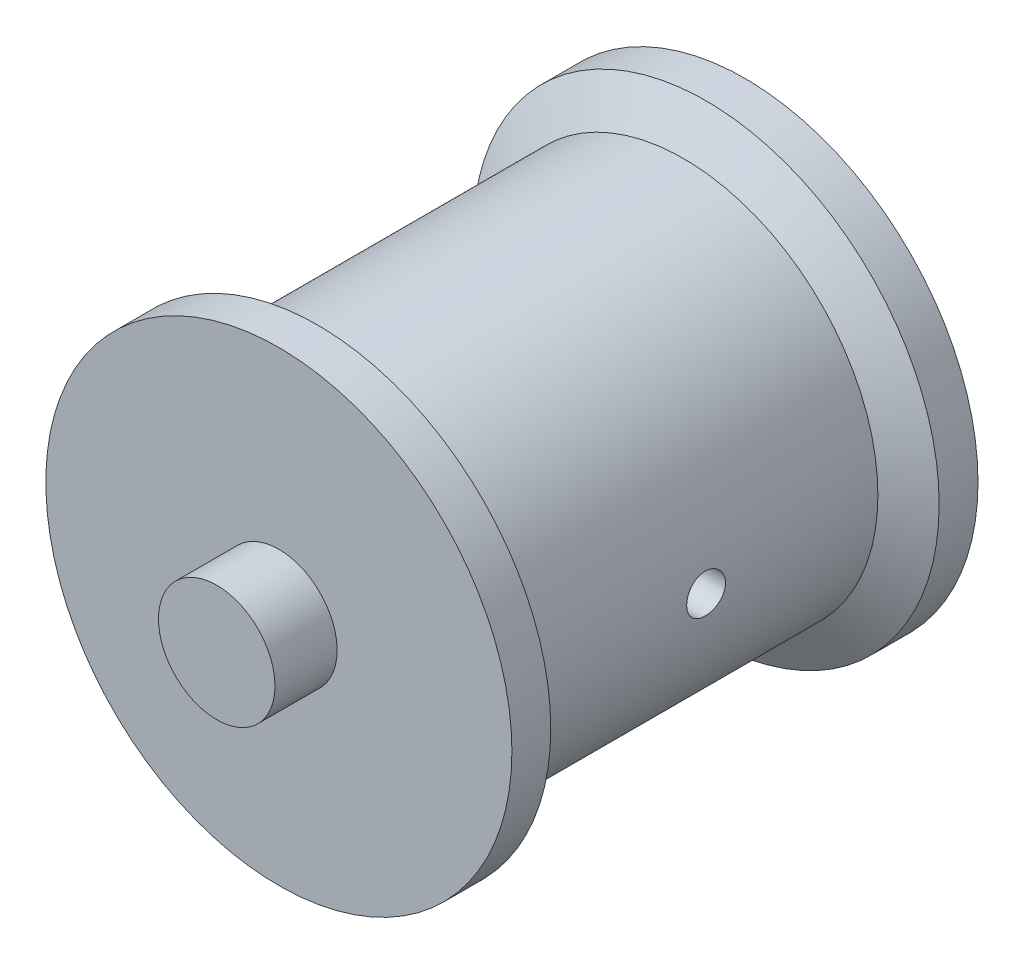
ISO-10303-21;
HEADER;
FILE_DESCRIPTION(('STEP AP214'),'2;1');
FILE_NAME('part.step','',(''),(''),'','','');
FILE_SCHEMA(('AUTOMOTIVE_DESIGN { 1 0 10303 214 1 1 1 1 }'));
ENDSEC;
DATA;
#1=APPLICATION_CONTEXT('core data for automotive mechanical design processes');
#2=APPLICATION_PROTOCOL_DEFINITION('international standard','automotive_design',2000,#1);
#3=PRODUCT_CONTEXT('',#1,'mechanical');
#4=PRODUCT('Part','Part','',(#3));
#5=PRODUCT_RELATED_PRODUCT_CATEGORY('part','',(#4));
#6=PRODUCT_DEFINITION_FORMATION('','',#4);
#7=PRODUCT_DEFINITION_CONTEXT('part definition',#1,'design');
#8=PRODUCT_DEFINITION('design','',#6,#7);
#9=PRODUCT_DEFINITION_SHAPE('','',#8);
#10=(LENGTH_UNIT() NAMED_UNIT(*) SI_UNIT(.MILLI.,.METRE.));
#11=(NAMED_UNIT(*) PLANE_ANGLE_UNIT() SI_UNIT($,.RADIAN.));
#12=(NAMED_UNIT(*) SI_UNIT($,.STERADIAN.) SOLID_ANGLE_UNIT());
#13=UNCERTAINTY_MEASURE_WITH_UNIT(LENGTH_MEASURE(1.E-05),#10,'distance_accuracy_value','');
#14=(GEOMETRIC_REPRESENTATION_CONTEXT(3) GLOBAL_UNCERTAINTY_ASSIGNED_CONTEXT((#13)) GLOBAL_UNIT_ASSIGNED_CONTEXT((#10,
#11,#12)) REPRESENTATION_CONTEXT('',''));
#15=CARTESIAN_POINT('',(0.,0.,0.));
#16=DIRECTION('',(0.,0.,1.));
#17=DIRECTION('',(1.,0.,0.));
#18=AXIS2_PLACEMENT_3D('',#15,#16,#17);
#19=CARTESIAN_POINT('',(0.,0.,10.));
#20=DIRECTION('',(0.,0.,-1.));
#21=DIRECTION('',(-1.,0.,0.));
#22=AXIS2_PLACEMENT_3D('',#19,#20,#21);
#23=CYLINDRICAL_SURFACE('',#22,2.75);
#24=CARTESIAN_POINT('',(0.,0.,0.));
#25=DIRECTION('',(0.,0.,1.));
#26=DIRECTION('',(1.,0.,0.));
#27=AXIS2_PLACEMENT_3D('',#24,#25,#26);
#28=CIRCLE('',#27,2.75);
#29=CARTESIAN_POINT('',(-1.58113883008419,2.25,0.));
#30=VERTEX_POINT('',#29);
#31=CARTESIAN_POINT('',(1.58113883008419,2.25,0.));
#32=VERTEX_POINT('',#31);
#33=EDGE_CURVE('E107',#30,#32,#28,.T.);
#34=ORIENTED_EDGE('',*,*,#33,.F.);
#35=DIRECTION('',(0.,0.,-1.));
#36=VECTOR('',#35,1.);
#37=CARTESIAN_POINT('',(-1.58113883008419,2.25,10.));
#38=LINE('',#37,#36);
#39=CARTESIAN_POINT('',(-1.58113883008419,2.25,10.));
#40=VERTEX_POINT('',#39);
#41=EDGE_CURVE('E74',#40,#30,#38,.T.);
#42=ORIENTED_EDGE('',*,*,#41,.F.);
#43=CARTESIAN_POINT('',(0.,0.,10.));
#44=DIRECTION('',(0.,0.,1.));
#45=DIRECTION('',(1.,0.,0.));
#46=AXIS2_PLACEMENT_3D('',#43,#44,#45);
#47=CIRCLE('',#46,2.75);
#48=CARTESIAN_POINT('',(1.58113883008419,2.25,10.));
#49=VERTEX_POINT('',#48);
#50=EDGE_CURVE('E84',#40,#49,#47,.T.);
#51=ORIENTED_EDGE('',*,*,#50,.T.);
#52=DIRECTION('',(0.,0.,-1.));
#53=VECTOR('',#52,1.);
#54=CARTESIAN_POINT('',(1.58113883008419,2.25,10.));
#55=LINE('',#54,#53);
#56=EDGE_CURVE('E86',#49,#32,#55,.T.);
#57=ORIENTED_EDGE('',*,*,#56,.T.);
#58=EDGE_LOOP('',(#34,#42,#51,#57));
#59=FACE_BOUND('',#58,.T.);
#60=ADVANCED_FACE('F49',(#59),#23,.F.);
#61=CARTESIAN_POINT('',(0.,2.25,10.));
#62=DIRECTION('',(0.,1.,0.));
#63=DIRECTION('',(0.,0.,1.));
#64=AXIS2_PLACEMENT_3D('',#61,#62,#63);
#65=PLANE('',#64);
#66=DIRECTION('',(1.,0.,0.));
#67=VECTOR('',#66,1.);
#68=CARTESIAN_POINT('',(0.,2.25,0.));
#69=LINE('',#68,#67);
#70=EDGE_CURVE('E94',#30,#32,#69,.T.);
#71=ORIENTED_EDGE('',*,*,#70,.T.);
#72=ORIENTED_EDGE('',*,*,#56,.F.);
#73=DIRECTION('',(1.,0.,0.));
#74=VECTOR('',#73,1.);
#75=CARTESIAN_POINT('',(0.,2.25,10.));
#76=LINE('',#75,#74);
#77=EDGE_CURVE('E90',#40,#49,#76,.T.);
#78=ORIENTED_EDGE('',*,*,#77,.F.);
#79=ORIENTED_EDGE('',*,*,#41,.T.);
#80=EDGE_LOOP('',(#71,#72,#78,#79));
#81=FACE_BOUND('',#80,.T.);
#82=ADVANCED_FACE('F93',(#81),#65,.F.);
#83=CARTESIAN_POINT('',(0.,0.,10.));
#84=DIRECTION('',(0.,0.,-1.));
#85=DIRECTION('',(-1.,0.,0.));
#86=AXIS2_PLACEMENT_3D('',#83,#84,#85);
#87=CYLINDRICAL_SURFACE('',#86,10.);
#88=CARTESIAN_POINT('',(0.,0.,10.));
#89=DIRECTION('',(0.,0.,1.));
#90=DIRECTION('',(1.,0.,0.));
#91=AXIS2_PLACEMENT_3D('',#88,#89,#90);
#92=CIRCLE('',#91,10.);
#93=CARTESIAN_POINT('',(10.,0.,10.));
#94=VERTEX_POINT('',#93);
#95=EDGE_CURVE('E97',#94,#94,#92,.T.);
#96=ORIENTED_EDGE('',*,*,#95,.F.);
#97=EDGE_LOOP('',(#96));
#98=FACE_BOUND('',#97,.T.);
#99=CARTESIAN_POINT('',(0.,0.,0.));
#100=DIRECTION('',(0.,0.,1.));
#101=DIRECTION('',(1.,0.,0.));
#102=AXIS2_PLACEMENT_3D('',#99,#100,#101);
#103=CIRCLE('',#102,10.);
#104=CARTESIAN_POINT('',(10.,0.,0.));
#105=VERTEX_POINT('',#104);
#106=EDGE_CURVE('E91',#105,#105,#103,.T.);
#107=ORIENTED_EDGE('',*,*,#106,.T.);
#108=EDGE_LOOP('',(#107));
#109=FACE_BOUND('',#108,.T.);
#110=ADVANCED_FACE('F163',(#98,#109),#87,.T.);
#111=CARTESIAN_POINT('',(0.,0.,0.));
#112=DIRECTION('',(0.,0.,1.));
#113=DIRECTION('',(1.,0.,0.));
#114=AXIS2_PLACEMENT_3D('',#111,#112,#113);
#115=PLANE('',#114);
#116=ORIENTED_EDGE('',*,*,#33,.T.);
#117=ORIENTED_EDGE('',*,*,#70,.F.);
#118=EDGE_LOOP('',(#116,#117));
#119=FACE_BOUND('',#118,.T.);
#120=ORIENTED_EDGE('',*,*,#106,.F.);
#121=EDGE_LOOP('',(#120));
#122=FACE_BOUND('',#121,.T.);
#123=ADVANCED_FACE('F157',(#119,#122),#115,.F.);
#124=CARTESIAN_POINT('',(0.,0.,10.));
#125=DIRECTION('',(0.,0.,1.));
#126=DIRECTION('',(1.,0.,0.));
#127=AXIS2_PLACEMENT_3D('',#124,#125,#126);
#128=PLANE('',#127);
#129=ORIENTED_EDGE('',*,*,#95,.T.);
#130=EDGE_LOOP('',(#129));
#131=FACE_BOUND('',#130,.T.);
#132=CARTESIAN_POINT('',(0.,0.,9.99999999999999));
#133=DIRECTION('',(0.,0.,1.));
#134=DIRECTION('',(1.,0.,0.));
#135=AXIS2_PLACEMENT_3D('',#132,#133,#134);
#136=CIRCLE('',#135,30.);
#137=CARTESIAN_POINT('',(30.,0.,9.99999999999999));
#138=VERTEX_POINT('',#137);
#139=EDGE_CURVE('E196',#138,#138,#136,.T.);
#140=ORIENTED_EDGE('',*,*,#139,.F.);
#141=EDGE_LOOP('',(#140));
#142=FACE_BOUND('',#141,.T.);
#143=ADVANCED_FACE('F155',(#131,#142),#128,.F.);
#144=ORIENTED_EDGE('',*,*,#50,.F.);
#145=ORIENTED_EDGE('',*,*,#77,.T.);
#146=EDGE_LOOP('',(#144,#145));
#147=FACE_BOUND('',#146,.T.);
#148=ADVANCED_FACE('F99',(#147),#128,.F.);
#149=CARTESIAN_POINT('',(0.,0.,15.));
#150=DIRECTION('',(0.,0.,-1.));
#151=DIRECTION('',(-1.,0.,0.));
#152=AXIS2_PLACEMENT_3D('',#149,#150,#151);
#153=CYLINDRICAL_SURFACE('',#152,30.);
#154=CARTESIAN_POINT('',(0.,0.,15.));
#155=DIRECTION('',(0.,0.,1.));
#156=DIRECTION('',(1.,0.,0.));
#157=AXIS2_PLACEMENT_3D('',#154,#155,#156);
#158=CIRCLE('',#157,30.);
#159=CARTESIAN_POINT('',(30.,0.,15.));
#160=VERTEX_POINT('',#159);
#161=EDGE_CURVE('E194',#160,#160,#158,.T.);
#162=ORIENTED_EDGE('',*,*,#161,.F.);
#163=EDGE_LOOP('',(#162));
#164=FACE_BOUND('',#163,.T.);
#165=ORIENTED_EDGE('',*,*,#139,.T.);
#166=EDGE_LOOP('',(#165));
#167=FACE_BOUND('',#166,.T.);
#168=ADVANCED_FACE('F143',(#164,#167),#153,.T.);
#169=CARTESIAN_POINT('',(0.,0.,70.));
#170=DIRECTION('',(0.,0.,1.));
#171=DIRECTION('',(1.,0.,0.));
#172=AXIS2_PLACEMENT_3D('',#169,#170,#171);
#173=PLANE('',#172);
#174=CARTESIAN_POINT('',(0.,0.,70.));
#175=DIRECTION('',(0.,0.,1.));
#176=DIRECTION('',(1.,0.,0.));
#177=AXIS2_PLACEMENT_3D('',#174,#175,#176);
#178=CIRCLE('',#177,7.5);
#179=CARTESIAN_POINT('',(7.5,0.,70.));
#180=VERTEX_POINT('',#179);
#181=EDGE_CURVE('E11',#180,#180,#178,.T.);
#182=ORIENTED_EDGE('',*,*,#181,.F.);
#183=EDGE_LOOP('',(#182));
#184=FACE_BOUND('',#183,.T.);
#185=CARTESIAN_POINT('',(0.,0.,70.));
#186=DIRECTION('',(0.,0.,1.));
#187=DIRECTION('',(1.,0.,0.));
#188=AXIS2_PLACEMENT_3D('',#185,#186,#187);
#189=CIRCLE('',#188,30.);
#190=CARTESIAN_POINT('',(30.,0.,70.));
#191=VERTEX_POINT('',#190);
#192=EDGE_CURVE('E190',#191,#191,#189,.T.);
#193=ORIENTED_EDGE('',*,*,#192,.T.);
#194=EDGE_LOOP('',(#193));
#195=FACE_BOUND('',#194,.T.);
#196=ADVANCED_FACE('F147',(#184,#195),#173,.T.);
#197=CARTESIAN_POINT('',(0.,0.,65.));
#198=DIRECTION('',(0.,0.,1.));
#199=DIRECTION('',(1.,0.,0.));
#200=AXIS2_PLACEMENT_3D('',#197,#198,#199);
#201=CYLINDRICAL_SURFACE('',#200,30.);
#202=CARTESIAN_POINT('',(0.,0.,65.));
#203=DIRECTION('',(0.,0.,1.));
#204=DIRECTION('',(1.,0.,0.));
#205=AXIS2_PLACEMENT_3D('',#202,#203,#204);
#206=CIRCLE('',#205,30.);
#207=CARTESIAN_POINT('',(30.,0.,65.));
#208=VERTEX_POINT('',#207);
#209=EDGE_CURVE('E110',#208,#208,#206,.T.);
#210=ORIENTED_EDGE('',*,*,#209,.T.);
#211=EDGE_LOOP('',(#210));
#212=FACE_BOUND('',#211,.T.);
#213=ORIENTED_EDGE('',*,*,#192,.F.);
#214=EDGE_LOOP('',(#213));
#215=FACE_BOUND('',#214,.T.);
#216=ADVANCED_FACE('F149',(#212,#215),#201,.T.);
#217=CARTESIAN_POINT('',(0.,0.,70.));
#218=DIRECTION('',(0.,0.,-1.));
#219=DIRECTION('',(-1.,0.,0.));
#220=AXIS2_PLACEMENT_3D('',#217,#218,#219);
#221=CYLINDRICAL_SURFACE('',#220,25.);
#222=CARTESIAN_POINT('',(-25.,0.,42.5));
#223=CARTESIAN_POINT('',(-24.9999983880192,-0.140050884478894,42.499993935249));
#224=CARTESIAN_POINT('',(-24.9988106399051,-0.280194362919434,42.4881918277589));
#225=CARTESIAN_POINT('',(-24.9941866898684,-0.556595996242094,42.4412890742739));
#226=CARTESIAN_POINT('',(-24.9907480108506,-0.692849697922071,42.4061627599385));
#227=CARTESIAN_POINT('',(-24.9820103640768,-0.957429188633536,42.3136443985054));
#228=CARTESIAN_POINT('',(-24.9767125200177,-1.08575971153727,42.2562657987038));
#229=CARTESIAN_POINT('',(-24.9648489348577,-1.33094040240102,42.1208977301709));
#230=CARTESIAN_POINT('',(-24.9582834459533,-1.44779284694769,42.0429123599997));
#231=CARTESIAN_POINT('',(-24.9445936085331,-1.66714887668521,41.8682432558443));
#232=CARTESIAN_POINT('',(-24.9374675393466,-1.76960536208723,41.7715005014949));
#233=CARTESIAN_POINT('',(-24.9234739226566,-1.95685630357747,41.5621886643424));
#234=CARTESIAN_POINT('',(-24.9166063871229,-2.04164994270664,41.449618849894));
#235=CARTESIAN_POINT('',(-24.9038897888196,-2.19133492610905,41.2115536707909));
#236=CARTESIAN_POINT('',(-24.8980429177726,-2.2561836636372,41.0860313897629));
#237=CARTESIAN_POINT('',(-24.8880509386631,-2.3638659618569,40.8258110352375));
#238=CARTESIAN_POINT('',(-24.8839057885556,-2.40670006647823,40.6911131885401));
#239=CARTESIAN_POINT('',(-24.8778021018244,-2.46899760400474,40.416845497835));
#240=CARTESIAN_POINT('',(-24.8758362599524,-2.48853913250949,40.2772935578695));
#241=CARTESIAN_POINT('',(-24.8742910765131,-2.50393821283841,39.9968778415106));
#242=CARTESIAN_POINT('',(-24.8747116722186,-2.49979638717701,39.8560140996949));
#243=CARTESIAN_POINT('',(-24.8778851724734,-2.46801070063171,39.5775117257667));
#244=CARTESIAN_POINT('',(-24.8806296147663,-2.44045211031139,39.4398632516783));
#245=CARTESIAN_POINT('',(-24.8881283571855,-2.36274786037648,39.1711550919973));
#246=CARTESIAN_POINT('',(-24.8928826844623,-2.31260189563938,39.0400954954374));
#247=CARTESIAN_POINT('',(-24.9038752363018,-2.19105223470378,38.7880160317528));
#248=CARTESIAN_POINT('',(-24.9101160977039,-2.11961070679996,38.6670145262767));
#249=CARTESIAN_POINT('',(-24.923376293322,-1.95752506838308,38.4386869627203));
#250=CARTESIAN_POINT('',(-24.9303956503196,-1.86688039584128,38.3313613050456));
#251=CARTESIAN_POINT('',(-24.9444596328247,-1.66848528103018,38.1329365150274));
#252=CARTESIAN_POINT('',(-24.9515042333249,-1.56066119712842,38.041910995298));
#253=CARTESIAN_POINT('',(-24.964795726963,-1.33122370434279,37.879240917724));
#254=CARTESIAN_POINT('',(-24.9710426192064,-1.20961027999902,37.8075963816088));
#255=CARTESIAN_POINT('',(-24.9820368916774,-0.955995264230927,37.6857249492244));
#256=CARTESIAN_POINT('',(-24.9867840103692,-0.823991865974773,37.6355017879548));
#257=CARTESIAN_POINT('',(-24.9942411860352,-0.553368043324844,37.5579527082206));
#258=CARTESIAN_POINT('',(-24.9969513039266,-0.414747816941513,37.5306261050234));
#259=CARTESIAN_POINT('',(-25.0000212917078,-0.13546274772977,37.4997392306631));
#260=CARTESIAN_POINT('',(-25.0003912066934,0.00519075526371878,37.4960773793687));
#261=CARTESIAN_POINT('',(-24.9987660439199,0.285109483289238,37.5123571576219));
#262=CARTESIAN_POINT('',(-24.9967709981117,0.424374727051163,37.5322984682882));
#263=CARTESIAN_POINT('',(-24.9906465384799,0.697270517086675,37.5951342385539));
#264=CARTESIAN_POINT('',(-24.986521547951,0.830912122430036,37.637981136195));
#265=CARTESIAN_POINT('',(-24.9765999715152,1.08911080345944,37.7453629350932));
#266=CARTESIAN_POINT('',(-24.9708033481313,1.21366767539278,37.8098983225985));
#267=CARTESIAN_POINT('',(-24.9581618832606,1.45062045043035,37.9590770966598));
#268=CARTESIAN_POINT('',(-24.951313590086,1.56297414937229,38.0437872223145));
#269=CARTESIAN_POINT('',(-24.937348321738,1.77190405827969,38.2308151693523));
#270=CARTESIAN_POINT('',(-24.9302313398243,1.86847987212293,38.3331334326758));
#271=CARTESIAN_POINT('',(-24.9165006035189,2.04346527471786,38.5529164366475));
#272=CARTESIAN_POINT('',(-24.9098887534744,2.12180819669885,38.6704343913565));
#273=CARTESIAN_POINT('',(-24.8979458115222,2.25764564685956,38.9170184003667));
#274=CARTESIAN_POINT('',(-24.8926147021009,2.3151404601347,39.046084296721));
#275=CARTESIAN_POINT('',(-24.8838486908512,2.40753802171118,39.3118718486645));
#276=CARTESIAN_POINT('',(-24.8804104612447,2.44248043702965,39.4485796002278));
#277=CARTESIAN_POINT('',(-24.8758091320719,2.48891001782365,39.7259579949019));
#278=CARTESIAN_POINT('',(-24.8746459672547,2.50039785599879,39.8666285242392));
#279=CARTESIAN_POINT('',(-24.8747278276891,2.49958284617814,40.1472767208918));
#280=CARTESIAN_POINT('',(-24.8759622521752,2.48738472398278,40.287254707207));
#281=CARTESIAN_POINT('',(-24.8806775972386,2.43976363240913,40.5631622929207));
#282=CARTESIAN_POINT('',(-24.884158520343,2.4043406369054,40.6990918877649));
#283=CARTESIAN_POINT('',(-24.8929717065797,2.31130421574375,40.9630433726196));
#284=CARTESIAN_POINT('',(-24.898303713509,2.25369386085229,41.0910663540743));
#285=CARTESIAN_POINT('',(-24.910218795984,2.1179288872776,41.3356422291776));
#286=CARTESIAN_POINT('',(-24.9168018645238,2.03977438363853,41.4521951870516));
#287=CARTESIAN_POINT('',(-24.9305121802424,1.86474639071333,41.6710591861798));
#288=CARTESIAN_POINT('',(-24.9376416181688,1.76779487222567,41.7733076909177));
#289=CARTESIAN_POINT('',(-24.9516213682196,1.55807924806277,41.9601305817491));
#290=CARTESIAN_POINT('',(-24.9584716130744,1.44531136027064,42.0447007283929));
#291=CARTESIAN_POINT('',(-24.971139051729,1.20685358540323,42.1939336346365));
#292=CARTESIAN_POINT('',(-24.9769536006703,1.08113187336691,42.258545727363));
#293=CARTESIAN_POINT('',(-24.9868657312474,0.820645697751378,42.3656560570597));
#294=CARTESIAN_POINT('',(-24.9909652477413,0.685891624564022,42.4081792273839));
#295=CARTESIAN_POINT('',(-24.9959553443433,0.458645653514259,42.459301542712));
#296=CARTESIAN_POINT('',(-24.9974650172958,0.367606382111271,42.4745426107484));
#297=CARTESIAN_POINT('',(-24.9994878737697,0.184391452043282,42.4948938151544));
#298=CARTESIAN_POINT('',(-25.0000010614006,0.0922157980663945,42.5000039933046));
#299=CARTESIAN_POINT('',(-25.,0.,42.5));
#300=B_SPLINE_CURVE_WITH_KNOTS('',3,(#222,#223,#224,#225,#226,#227,#228,#229,#230,#231,#232,
#233,#234,#235,#236,#237,#238,#239,#240,#241,#242,#243,#244,#245,#246,#247,#248,#249,#250,#251,
#252,#253,#254,#255,#256,#257,#258,#259,#260,#261,#262,#263,#264,#265,#266,#267,#268,#269,#270,
#271,#272,#273,#274,#275,#276,#277,#278,#279,#280,#281,#282,#283,#284,#285,#286,#287,#288,#289,
#290,#291,#292,#293,#294,#295,#296,#297,#298,#299),.UNSPECIFIED.,.T.,.F.,(4,2,2,2,2,2,2,2,2,2,2,
2,2,2,2,2,2,2,2,2,2,2,2,2,2,2,2,2,2,2,2,2,2,2,2,2,2,2,4),(0.,0.419815915671185,
0.840094607088717,1.2601197143305,1.68006134395696,2.10134642155736,2.52265098051765,
2.94484938680554,3.3670373610626,3.78780580112991,4.20856318139441,4.62779493602776,
5.04703235404084,5.46701903432236,5.88701800827814,6.30886835490517,6.73071917449429,
7.15264351733954,7.57455524188599,7.99465471519395,8.41474851297859,8.83397338235763,
9.25320765123668,9.67384851871747,10.0944999452558,10.516666090215,10.9388264618844,
11.3602422648251,11.7816459809896,12.2011907323489,12.620735955651,13.04022313407,
13.459707963474,13.8809729356913,14.3023388159239,14.7247657756561,15.1467148698824,
15.4231416808087,15.6995673517257),.UNSPECIFIED.);
#301=CARTESIAN_POINT('',(-25.,0.,42.5));
#302=VERTEX_POINT('',#301);
#303=EDGE_CURVE('E54',#302,#302,#300,.T.);
#304=ORIENTED_EDGE('',*,*,#303,.T.);
#305=EDGE_LOOP('',(#304));
#306=FACE_BOUND('',#305,.T.);
#307=CARTESIAN_POINT('',(25.,0.,37.5));
#308=CARTESIAN_POINT('',(24.9999983880192,-0.1400508844789,37.5000060647509));
#309=CARTESIAN_POINT('',(24.9988106399051,-0.280194362919439,37.5118081722411));
#310=CARTESIAN_POINT('',(24.9941866898684,-0.556595996242099,37.5587109257261));
#311=CARTESIAN_POINT('',(24.9907480108506,-0.692849697922077,37.5938372400615));
#312=CARTESIAN_POINT('',(24.9820103640768,-0.957429188633542,37.6863556014946));
#313=CARTESIAN_POINT('',(24.9767125200177,-1.08575971153728,37.7437342012962));
#314=CARTESIAN_POINT('',(24.9648489348577,-1.33094040240102,37.8791022698291));
#315=CARTESIAN_POINT('',(24.9582834459533,-1.4477928469477,37.9570876400003));
#316=CARTESIAN_POINT('',(24.9445936085331,-1.66714887668521,38.1317567441557));
#317=CARTESIAN_POINT('',(24.9374675393466,-1.76960536208724,38.2284994985051));
#318=CARTESIAN_POINT('',(24.9234739226566,-1.95685630357747,38.4378113356576));
#319=CARTESIAN_POINT('',(24.9166063871229,-2.04164994270664,38.550381150106));
#320=CARTESIAN_POINT('',(24.9038897888196,-2.19133492610905,38.788446329209));
#321=CARTESIAN_POINT('',(24.8980429177726,-2.2561836636372,38.9139686102371));
#322=CARTESIAN_POINT('',(24.8880509386631,-2.3638659618569,39.1741889647624));
#323=CARTESIAN_POINT('',(24.8839057885556,-2.40670006647823,39.3088868114599));
#324=CARTESIAN_POINT('',(24.8778021018244,-2.46899760400474,39.583154502165));
#325=CARTESIAN_POINT('',(24.8758362599524,-2.4885391325095,39.7227064421305));
#326=CARTESIAN_POINT('',(24.8742910765131,-2.50393821283841,40.0031221584894));
#327=CARTESIAN_POINT('',(24.8747116722186,-2.49979638717701,40.1439859003051));
#328=CARTESIAN_POINT('',(24.8778851724734,-2.4680107006317,40.4224882742333));
#329=CARTESIAN_POINT('',(24.8806296147663,-2.44045211031139,40.5601367483217));
#330=CARTESIAN_POINT('',(24.8881283571855,-2.36274786037648,40.8288449080027));
#331=CARTESIAN_POINT('',(24.8928826844623,-2.31260189563938,40.9599045045626));
#332=CARTESIAN_POINT('',(24.9038752363018,-2.19105223470378,41.2119839682472));
#333=CARTESIAN_POINT('',(24.9101160977039,-2.11961070679996,41.3329854737233));
#334=CARTESIAN_POINT('',(24.923376293322,-1.95752506838308,41.5613130372797));
#335=CARTESIAN_POINT('',(24.9303956503196,-1.86688039584127,41.6686386949544));
#336=CARTESIAN_POINT('',(24.9444596328247,-1.66848528103018,41.8670634849726));
#337=CARTESIAN_POINT('',(24.9515042333249,-1.56066119712842,41.958089004702));
#338=CARTESIAN_POINT('',(24.964795726963,-1.33122370434279,42.120759082276));
#339=CARTESIAN_POINT('',(24.9710426192064,-1.20961027999901,42.1924036183912));
#340=CARTESIAN_POINT('',(24.9820368916774,-0.955995264230917,42.3142750507756));
#341=CARTESIAN_POINT('',(24.9867840103692,-0.823991865974764,42.3644982120451));
#342=CARTESIAN_POINT('',(24.9942411860352,-0.553368043324837,42.4420472917794));
#343=CARTESIAN_POINT('',(24.9969513039266,-0.414747816941508,42.4693738949766));
#344=CARTESIAN_POINT('',(25.0000212917078,-0.135462747729766,42.5002607693369));
#345=CARTESIAN_POINT('',(25.0003912066934,0.00519075526372306,42.5039226206312));
#346=CARTESIAN_POINT('',(24.9987660439199,0.285109483289243,42.4876428423781));
#347=CARTESIAN_POINT('',(24.9967709981117,0.424374727051168,42.4677015317118));
#348=CARTESIAN_POINT('',(24.9906465384799,0.697270517086679,42.4048657614461));
#349=CARTESIAN_POINT('',(24.986521547951,0.83091212243004,42.362018863805));
#350=CARTESIAN_POINT('',(24.9765999715152,1.08911080345945,42.2546370649068));
#351=CARTESIAN_POINT('',(24.9708033481313,1.21366767539279,42.1901016774015));
#352=CARTESIAN_POINT('',(24.9581618832606,1.45062045043035,42.0409229033402));
#353=CARTESIAN_POINT('',(24.951313590086,1.56297414937229,41.9562127776855));
#354=CARTESIAN_POINT('',(24.937348321738,1.77190405827969,41.7691848306477));
#355=CARTESIAN_POINT('',(24.9302313398243,1.86847987212294,41.6668665673242));
#356=CARTESIAN_POINT('',(24.9165006035189,2.04346527471786,41.4470835633525));
#357=CARTESIAN_POINT('',(24.9098887534744,2.12180819669885,41.3295656086434));
#358=CARTESIAN_POINT('',(24.8979458115222,2.25764564685957,41.0829815996333));
#359=CARTESIAN_POINT('',(24.8926147021009,2.3151404601347,40.953915703279));
#360=CARTESIAN_POINT('',(24.8838486908512,2.40753802171118,40.6881281513355));
#361=CARTESIAN_POINT('',(24.8804104612447,2.44248043702965,40.5514203997722));
#362=CARTESIAN_POINT('',(24.8758091320719,2.48891001782365,40.2740420050981));
#363=CARTESIAN_POINT('',(24.8746459672547,2.50039785599879,40.1333714757608));
#364=CARTESIAN_POINT('',(24.8747278276891,2.49958284617814,39.8527232791082));
#365=CARTESIAN_POINT('',(24.8759622521752,2.48738472398277,39.712745292793));
#366=CARTESIAN_POINT('',(24.8806775972386,2.43976363240913,39.4368377070793));
#367=CARTESIAN_POINT('',(24.884158520343,2.40434063690539,39.300908112235));
#368=CARTESIAN_POINT('',(24.8929717065797,2.31130421574375,39.0369566273804));
#369=CARTESIAN_POINT('',(24.898303713509,2.25369386085229,38.9089336459257));
#370=CARTESIAN_POINT('',(24.910218795984,2.11792888727761,38.6643577708224));
#371=CARTESIAN_POINT('',(24.9168018645238,2.03977438363853,38.5478048129484));
#372=CARTESIAN_POINT('',(24.9305121802424,1.86474639071332,38.3289408138202));
#373=CARTESIAN_POINT('',(24.9376416181688,1.76779487222567,38.2266923090823));
#374=CARTESIAN_POINT('',(24.9516213682196,1.55807924806277,38.0398694182508));
#375=CARTESIAN_POINT('',(24.9584716130744,1.44531136027063,37.9552992716071));
#376=CARTESIAN_POINT('',(24.971139051729,1.20685358540322,37.8060663653634));
#377=CARTESIAN_POINT('',(24.9769536006703,1.0811318733669,37.741454272637));
#378=CARTESIAN_POINT('',(24.9868657312474,0.820645697751371,37.6343439429403));
#379=CARTESIAN_POINT('',(24.9909652477413,0.685891624564018,37.5918207726161));
#380=CARTESIAN_POINT('',(24.9959553443433,0.458645653514255,37.540698457288));
#381=CARTESIAN_POINT('',(24.9974650172958,0.367606382111266,37.5254573892516));
#382=CARTESIAN_POINT('',(24.9994878737697,0.184391452043276,37.5051061848456));
#383=CARTESIAN_POINT('',(25.0000010614006,0.0922157980663877,37.4999960066953));
#384=CARTESIAN_POINT('',(25.,0.,37.5));
#385=B_SPLINE_CURVE_WITH_KNOTS('',3,(#307,#308,#309,#310,#311,#312,#313,#314,#315,#316,#317,
#318,#319,#320,#321,#322,#323,#324,#325,#326,#327,#328,#329,#330,#331,#332,#333,#334,#335,#336,
#337,#338,#339,#340,#341,#342,#343,#344,#345,#346,#347,#348,#349,#350,#351,#352,#353,#354,#355,
#356,#357,#358,#359,#360,#361,#362,#363,#364,#365,#366,#367,#368,#369,#370,#371,#372,#373,#374,
#375,#376,#377,#378,#379,#380,#381,#382,#383,#384),.UNSPECIFIED.,.T.,.F.,(4,2,2,2,2,2,2,2,2,2,2,
2,2,2,2,2,2,2,2,2,2,2,2,2,2,2,2,2,2,2,2,2,2,2,2,2,2,2,4),(0.,0.419815915671183,
0.840094607088716,1.2601197143305,1.68006134395695,2.10134642155736,2.52265098051765,
2.94484938680554,3.3670373610626,3.78780580112991,4.20856318139442,4.62779493602776,
5.04703235404085,5.46701903432238,5.88701800827814,6.30886835490517,6.7307191744943,
7.15264351733954,7.57455524188599,7.99465471519395,8.41474851297859,8.83397338235762,
9.25320765123668,9.67384851871747,10.0944999452558,10.516666090215,10.9388264618844,
11.3602422648251,11.7816459809896,12.2011907323489,12.620735955651,13.04022313407,
13.459707963474,13.8809729356914,14.302338815924,14.7247657756561,15.1467148698824,
15.4231416808087,15.6995673517257),.UNSPECIFIED.);
#386=CARTESIAN_POINT('',(25.,0.,37.5));
#387=VERTEX_POINT('',#386);
#388=EDGE_CURVE('E124',#387,#387,#385,.T.);
#389=ORIENTED_EDGE('',*,*,#388,.T.);
#390=EDGE_LOOP('',(#389));
#391=FACE_BOUND('',#390,.T.);
#392=CARTESIAN_POINT('',(0.,0.,62.1132486540518));
#393=DIRECTION('',(0.,0.,1.));
#394=DIRECTION('',(1.,0.,0.));
#395=AXIS2_PLACEMENT_3D('',#392,#393,#394);
#396=CIRCLE('',#395,25.);
#397=CARTESIAN_POINT('',(25.,0.,62.1132486540518));
#398=VERTEX_POINT('',#397);
#399=EDGE_CURVE('E66',#398,#398,#396,.F.);
#400=ORIENTED_EDGE('',*,*,#399,.T.);
#401=EDGE_LOOP('',(#400));
#402=FACE_BOUND('',#401,.T.);
#403=CARTESIAN_POINT('',(0.,0.,17.8867513459481));
#404=DIRECTION('',(0.,0.,-1.));
#405=DIRECTION('',(-1.,0.,0.));
#406=AXIS2_PLACEMENT_3D('',#403,#404,#405);
#407=CIRCLE('',#406,25.);
#408=CARTESIAN_POINT('',(-25.,0.,17.8867513459481));
#409=VERTEX_POINT('',#408);
#410=EDGE_CURVE('E118',#409,#409,#407,.F.);
#411=ORIENTED_EDGE('',*,*,#410,.T.);
#412=EDGE_LOOP('',(#411));
#413=FACE_BOUND('',#412,.T.);
#414=ADVANCED_FACE('F131',(#306,#391,#402,#413),#221,.T.);
#415=CARTESIAN_POINT('',(0.,0.,65.));
#416=DIRECTION('',(0.,0.,1.));
#417=DIRECTION('',(1.,0.,0.));
#418=AXIS2_PLACEMENT_3D('',#415,#416,#417);
#419=CONICAL_SURFACE('',#418,30.,1.04719755119659);
#420=ORIENTED_EDGE('',*,*,#399,.F.);
#421=EDGE_LOOP('',(#420));
#422=FACE_BOUND('',#421,.T.);
#423=ORIENTED_EDGE('',*,*,#209,.F.);
#424=EDGE_LOOP('',(#423));
#425=FACE_BOUND('',#424,.T.);
#426=ADVANCED_FACE('F174',(#422,#425),#419,.T.);
#427=CARTESIAN_POINT('',(0.,0.,15.));
#428=DIRECTION('',(0.,0.,-1.));
#429=DIRECTION('',(-1.,0.,0.));
#430=AXIS2_PLACEMENT_3D('',#427,#428,#429);
#431=CONICAL_SURFACE('',#430,29.9999999999999,1.04719755119659);
#432=ORIENTED_EDGE('',*,*,#410,.F.);
#433=EDGE_LOOP('',(#432));
#434=FACE_BOUND('',#433,.T.);
#435=ORIENTED_EDGE('',*,*,#161,.T.);
#436=EDGE_LOOP('',(#435));
#437=FACE_BOUND('',#436,.T.);
#438=ADVANCED_FACE('F52',(#434,#437),#431,.T.);
#439=CARTESIAN_POINT('',(-30.,0.,40.));
#440=DIRECTION('',(1.,0.,0.));
#441=DIRECTION('',(0.,0.,-1.));
#442=AXIS2_PLACEMENT_3D('',#439,#440,#441);
#443=CYLINDRICAL_SURFACE('',#442,2.5);
#444=ORIENTED_EDGE('',*,*,#388,.F.);
#445=EDGE_LOOP('',(#444));
#446=FACE_BOUND('',#445,.T.);
#447=ORIENTED_EDGE('',*,*,#303,.F.);
#448=EDGE_LOOP('',(#447));
#449=FACE_BOUND('',#448,.T.);
#450=ADVANCED_FACE('F135',(#446,#449),#443,.F.);
#451=CARTESIAN_POINT('',(0.,0.,78.));
#452=DIRECTION('',(0.,0.,-1.));
#453=DIRECTION('',(-1.,0.,0.));
#454=AXIS2_PLACEMENT_3D('',#451,#452,#453);
#455=CYLINDRICAL_SURFACE('',#454,7.5);
#456=CARTESIAN_POINT('',(0.,0.,78.));
#457=DIRECTION('',(0.,0.,1.));
#458=DIRECTION('',(1.,0.,0.));
#459=AXIS2_PLACEMENT_3D('',#456,#457,#458);
#460=CIRCLE('',#459,7.5);
#461=CARTESIAN_POINT('',(7.5,0.,78.));
#462=VERTEX_POINT('',#461);
#463=EDGE_CURVE('E130',#462,#462,#460,.T.);
#464=ORIENTED_EDGE('',*,*,#463,.F.);
#465=EDGE_LOOP('',(#464));
#466=FACE_BOUND('',#465,.T.);
#467=ORIENTED_EDGE('',*,*,#181,.T.);
#468=EDGE_LOOP('',(#467));
#469=FACE_BOUND('',#468,.T.);
#470=ADVANCED_FACE('F140',(#466,#469),#455,.T.);
#471=CARTESIAN_POINT('',(0.,0.,78.));
#472=DIRECTION('',(0.,0.,1.));
#473=DIRECTION('',(1.,0.,0.));
#474=AXIS2_PLACEMENT_3D('',#471,#472,#473);
#475=PLANE('',#474);
#476=ORIENTED_EDGE('',*,*,#463,.T.);
#477=EDGE_LOOP('',(#476));
#478=FACE_BOUND('',#477,.T.);
#479=ADVANCED_FACE('F207',(#478),#475,.T.);
#480=CLOSED_SHELL('',(#60,#82,#110,#123,#143,#148,#168,#196,#216,#414,#426,#438,#450,#470,#479));
#481=MANIFOLD_SOLID_BREP('B2',#480);
#482=ADVANCED_BREP_SHAPE_REPRESENTATION('',(#18,#481),#14);
#483=SHAPE_DEFINITION_REPRESENTATION(#9,#482);
ENDSEC;
END-ISO-10303-21;
